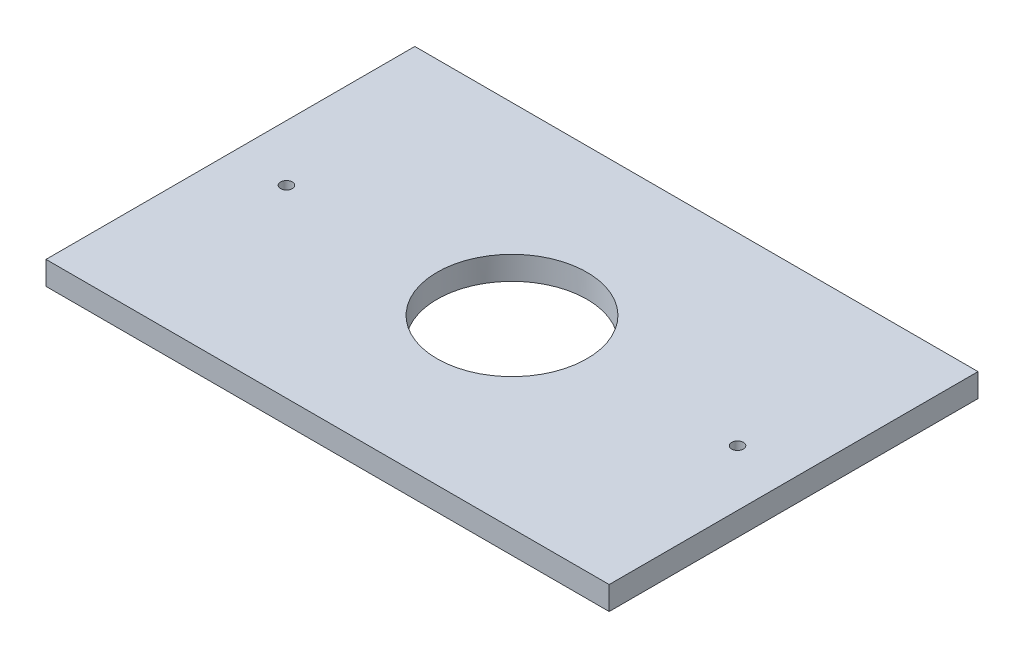
ISO-10303-21;
HEADER;
FILE_DESCRIPTION(('STEP AP214'),'2;1');
FILE_NAME('part.step','',(''),(''),'','','');
FILE_SCHEMA(('AUTOMOTIVE_DESIGN { 1 0 10303 214 1 1 1 1 }'));
ENDSEC;
DATA;
#1=APPLICATION_CONTEXT('core data for automotive mechanical design processes');
#2=APPLICATION_PROTOCOL_DEFINITION('international standard','automotive_design',2000,#1);
#3=PRODUCT_CONTEXT('',#1,'mechanical');
#4=PRODUCT('Part','Part','',(#3));
#5=PRODUCT_RELATED_PRODUCT_CATEGORY('part','',(#4));
#6=PRODUCT_DEFINITION_FORMATION('','',#4);
#7=PRODUCT_DEFINITION_CONTEXT('part definition',#1,'design');
#8=PRODUCT_DEFINITION('design','',#6,#7);
#9=PRODUCT_DEFINITION_SHAPE('','',#8);
#10=(LENGTH_UNIT() NAMED_UNIT(*) SI_UNIT(.MILLI.,.METRE.));
#11=(NAMED_UNIT(*) PLANE_ANGLE_UNIT() SI_UNIT($,.RADIAN.));
#12=(NAMED_UNIT(*) SI_UNIT($,.STERADIAN.) SOLID_ANGLE_UNIT());
#13=UNCERTAINTY_MEASURE_WITH_UNIT(LENGTH_MEASURE(1.E-05),#10,'distance_accuracy_value','');
#14=(GEOMETRIC_REPRESENTATION_CONTEXT(3) GLOBAL_UNCERTAINTY_ASSIGNED_CONTEXT((#13)) GLOBAL_UNIT_ASSIGNED_CONTEXT((#10,
#11,#12)) REPRESENTATION_CONTEXT('',''));
#15=CARTESIAN_POINT('',(0.,0.,0.));
#16=DIRECTION('',(0.,0.,1.));
#17=DIRECTION('',(1.,0.,0.));
#18=AXIS2_PLACEMENT_3D('',#15,#16,#17);
#19=CARTESIAN_POINT('',(0.,6.35,0.));
#20=DIRECTION('',(1.,0.,0.));
#21=DIRECTION('',(0.,0.,-1.));
#22=AXIS2_PLACEMENT_3D('',#19,#20,#21);
#23=PLANE('',#22);
#24=DIRECTION('',(0.,0.,1.));
#25=VECTOR('',#24,1.);
#26=CARTESIAN_POINT('',(0.,0.,0.));
#27=LINE('',#26,#25);
#28=CARTESIAN_POINT('',(0.,0.,-100.));
#29=VERTEX_POINT('',#28);
#30=CARTESIAN_POINT('',(0.,0.,0.));
#31=VERTEX_POINT('',#30);
#32=EDGE_CURVE('E99',#29,#31,#27,.T.);
#33=ORIENTED_EDGE('',*,*,#32,.T.);
#34=DIRECTION('',(0.,-1.,0.));
#35=VECTOR('',#34,1.);
#36=CARTESIAN_POINT('',(0.,6.35,0.));
#37=LINE('',#36,#35);
#38=CARTESIAN_POINT('',(0.,6.35,0.));
#39=VERTEX_POINT('',#38);
#40=EDGE_CURVE('E11',#39,#31,#37,.T.);
#41=ORIENTED_EDGE('',*,*,#40,.F.);
#42=DIRECTION('',(0.,0.,1.));
#43=VECTOR('',#42,1.);
#44=CARTESIAN_POINT('',(0.,6.35,0.));
#45=LINE('',#44,#43);
#46=CARTESIAN_POINT('',(0.,6.35,-100.));
#47=VERTEX_POINT('',#46);
#48=EDGE_CURVE('E86',#47,#39,#45,.T.);
#49=ORIENTED_EDGE('',*,*,#48,.F.);
#50=DIRECTION('',(0.,-1.,0.));
#51=VECTOR('',#50,1.);
#52=CARTESIAN_POINT('',(0.,6.35,-100.));
#53=LINE('',#52,#51);
#54=EDGE_CURVE('E95',#47,#29,#53,.T.);
#55=ORIENTED_EDGE('',*,*,#54,.T.);
#56=EDGE_LOOP('',(#33,#41,#49,#55));
#57=FACE_BOUND('',#56,.T.);
#58=ADVANCED_FACE('F33',(#57),#23,.F.);
#59=CARTESIAN_POINT('',(0.,6.35,0.));
#60=DIRECTION('',(0.,0.,-1.));
#61=DIRECTION('',(-1.,0.,0.));
#62=AXIS2_PLACEMENT_3D('',#59,#60,#61);
#63=PLANE('',#62);
#64=DIRECTION('',(1.,0.,0.));
#65=VECTOR('',#64,1.);
#66=CARTESIAN_POINT('',(0.,0.,0.));
#67=LINE('',#66,#65);
#68=CARTESIAN_POINT('',(152.7,0.,0.));
#69=VERTEX_POINT('',#68);
#70=EDGE_CURVE('E90',#31,#69,#67,.T.);
#71=ORIENTED_EDGE('',*,*,#70,.T.);
#72=DIRECTION('',(0.,-1.,0.));
#73=VECTOR('',#72,1.);
#74=CARTESIAN_POINT('',(152.7,6.35,0.));
#75=LINE('',#74,#73);
#76=CARTESIAN_POINT('',(152.7,6.35,0.));
#77=VERTEX_POINT('',#76);
#78=EDGE_CURVE('E42',#77,#69,#75,.T.);
#79=ORIENTED_EDGE('',*,*,#78,.F.);
#80=DIRECTION('',(1.,0.,0.));
#81=VECTOR('',#80,1.);
#82=CARTESIAN_POINT('',(0.,6.35,0.));
#83=LINE('',#82,#81);
#84=EDGE_CURVE('E81',#39,#77,#83,.T.);
#85=ORIENTED_EDGE('',*,*,#84,.F.);
#86=ORIENTED_EDGE('',*,*,#40,.T.);
#87=EDGE_LOOP('',(#71,#79,#85,#86));
#88=FACE_BOUND('',#87,.T.);
#89=ADVANCED_FACE('F89',(#88),#63,.F.);
#90=CARTESIAN_POINT('',(152.7,6.35,0.));
#91=DIRECTION('',(-1.,0.,0.));
#92=DIRECTION('',(0.,0.,1.));
#93=AXIS2_PLACEMENT_3D('',#90,#91,#92);
#94=PLANE('',#93);
#95=DIRECTION('',(0.,0.,-1.));
#96=VECTOR('',#95,1.);
#97=CARTESIAN_POINT('',(152.7,0.,0.));
#98=LINE('',#97,#96);
#99=CARTESIAN_POINT('',(152.7,0.,-100.));
#100=VERTEX_POINT('',#99);
#101=EDGE_CURVE('E68',#69,#100,#98,.T.);
#102=ORIENTED_EDGE('',*,*,#101,.T.);
#103=DIRECTION('',(0.,-1.,0.));
#104=VECTOR('',#103,1.);
#105=CARTESIAN_POINT('',(152.7,6.35,-100.));
#106=LINE('',#105,#104);
#107=CARTESIAN_POINT('',(152.7,6.35,-100.));
#108=VERTEX_POINT('',#107);
#109=EDGE_CURVE('E91',#108,#100,#106,.T.);
#110=ORIENTED_EDGE('',*,*,#109,.F.);
#111=DIRECTION('',(0.,0.,-1.));
#112=VECTOR('',#111,1.);
#113=CARTESIAN_POINT('',(152.7,6.35,0.));
#114=LINE('',#113,#112);
#115=EDGE_CURVE('E84',#77,#108,#114,.T.);
#116=ORIENTED_EDGE('',*,*,#115,.F.);
#117=ORIENTED_EDGE('',*,*,#78,.T.);
#118=EDGE_LOOP('',(#102,#110,#116,#117));
#119=FACE_BOUND('',#118,.T.);
#120=ADVANCED_FACE('F93',(#119),#94,.F.);
#121=CARTESIAN_POINT('',(0.,6.35,-100.));
#122=DIRECTION('',(0.,0.,1.));
#123=DIRECTION('',(1.,0.,0.));
#124=AXIS2_PLACEMENT_3D('',#121,#122,#123);
#125=PLANE('',#124);
#126=DIRECTION('',(-1.,0.,0.));
#127=VECTOR('',#126,1.);
#128=CARTESIAN_POINT('',(0.,0.,-100.));
#129=LINE('',#128,#127);
#130=EDGE_CURVE('E74',#100,#29,#129,.T.);
#131=ORIENTED_EDGE('',*,*,#130,.T.);
#132=ORIENTED_EDGE('',*,*,#54,.F.);
#133=DIRECTION('',(-1.,0.,0.));
#134=VECTOR('',#133,1.);
#135=CARTESIAN_POINT('',(0.,6.35,-100.));
#136=LINE('',#135,#134);
#137=EDGE_CURVE('E51',#108,#47,#136,.T.);
#138=ORIENTED_EDGE('',*,*,#137,.F.);
#139=ORIENTED_EDGE('',*,*,#109,.T.);
#140=EDGE_LOOP('',(#131,#132,#138,#139));
#141=FACE_BOUND('',#140,.T.);
#142=ADVANCED_FACE('F131',(#141),#125,.F.);
#143=CARTESIAN_POINT('',(0.,6.35,0.));
#144=DIRECTION('',(0.,-1.,0.));
#145=DIRECTION('',(0.,0.,-1.));
#146=AXIS2_PLACEMENT_3D('',#143,#144,#145);
#147=PLANE('',#146);
#148=CARTESIAN_POINT('',(15.2,6.35,-50.));
#149=DIRECTION('',(0.,1.,0.));
#150=DIRECTION('',(0.,0.,1.));
#151=AXIS2_PLACEMENT_3D('',#148,#149,#150);
#152=CIRCLE('',#151,1.5875);
#153=CARTESIAN_POINT('',(15.2,6.35,-48.4125));
#154=VERTEX_POINT('',#153);
#155=EDGE_CURVE('E112',#154,#154,#152,.T.);
#156=ORIENTED_EDGE('',*,*,#155,.F.);
#157=EDGE_LOOP('',(#156));
#158=FACE_BOUND('',#157,.T.);
#159=CARTESIAN_POINT('',(137.5,6.35,-50.));
#160=DIRECTION('',(0.,1.,0.));
#161=DIRECTION('',(0.,0.,1.));
#162=AXIS2_PLACEMENT_3D('',#159,#160,#161);
#163=CIRCLE('',#162,1.58749999999999);
#164=CARTESIAN_POINT('',(137.5,6.35,-48.4125));
#165=VERTEX_POINT('',#164);
#166=EDGE_CURVE('E117',#165,#165,#163,.T.);
#167=ORIENTED_EDGE('',*,*,#166,.F.);
#168=EDGE_LOOP('',(#167));
#169=FACE_BOUND('',#168,.T.);
#170=CARTESIAN_POINT('',(76.35,6.35,-50.));
#171=DIRECTION('',(0.,1.,0.));
#172=DIRECTION('',(0.,0.,1.));
#173=AXIS2_PLACEMENT_3D('',#170,#171,#172);
#174=CIRCLE('',#173,20.32);
#175=CARTESIAN_POINT('',(76.35,6.35,-29.68));
#176=VERTEX_POINT('',#175);
#177=EDGE_CURVE('E109',#176,#176,#174,.T.);
#178=ORIENTED_EDGE('',*,*,#177,.F.);
#179=EDGE_LOOP('',(#178));
#180=FACE_BOUND('',#179,.T.);
#181=ORIENTED_EDGE('',*,*,#48,.T.);
#182=ORIENTED_EDGE('',*,*,#84,.T.);
#183=ORIENTED_EDGE('',*,*,#115,.T.);
#184=ORIENTED_EDGE('',*,*,#137,.T.);
#185=EDGE_LOOP('',(#181,#182,#183,#184));
#186=FACE_BOUND('',#185,.T.);
#187=ADVANCED_FACE('F82',(#158,#169,#180,#186),#147,.F.);
#188=CARTESIAN_POINT('',(0.,0.,0.));
#189=DIRECTION('',(0.,-1.,0.));
#190=DIRECTION('',(0.,0.,-1.));
#191=AXIS2_PLACEMENT_3D('',#188,#189,#190);
#192=PLANE('',#191);
#193=CARTESIAN_POINT('',(15.2,0.,-50.));
#194=DIRECTION('',(0.,-1.,0.));
#195=DIRECTION('',(0.,0.,-1.));
#196=AXIS2_PLACEMENT_3D('',#193,#194,#195);
#197=CIRCLE('',#196,1.5875);
#198=CARTESIAN_POINT('',(15.2,0.,-51.5875));
#199=VERTEX_POINT('',#198);
#200=EDGE_CURVE('E36',#199,#199,#197,.T.);
#201=ORIENTED_EDGE('',*,*,#200,.F.);
#202=EDGE_LOOP('',(#201));
#203=FACE_BOUND('',#202,.T.);
#204=CARTESIAN_POINT('',(137.5,0.,-50.));
#205=DIRECTION('',(0.,-1.,0.));
#206=DIRECTION('',(0.,0.,-1.));
#207=AXIS2_PLACEMENT_3D('',#204,#205,#206);
#208=CIRCLE('',#207,1.58749999999999);
#209=CARTESIAN_POINT('',(137.5,0.,-51.5875));
#210=VERTEX_POINT('',#209);
#211=EDGE_CURVE('E110',#210,#210,#208,.T.);
#212=ORIENTED_EDGE('',*,*,#211,.F.);
#213=EDGE_LOOP('',(#212));
#214=FACE_BOUND('',#213,.T.);
#215=CARTESIAN_POINT('',(76.35,0.,-50.));
#216=DIRECTION('',(0.,-1.,0.));
#217=DIRECTION('',(0.,0.,-1.));
#218=AXIS2_PLACEMENT_3D('',#215,#216,#217);
#219=CIRCLE('',#218,20.32);
#220=CARTESIAN_POINT('',(76.35,0.,-70.32));
#221=VERTEX_POINT('',#220);
#222=EDGE_CURVE('E102',#221,#221,#219,.T.);
#223=ORIENTED_EDGE('',*,*,#222,.F.);
#224=EDGE_LOOP('',(#223));
#225=FACE_BOUND('',#224,.T.);
#226=ORIENTED_EDGE('',*,*,#32,.F.);
#227=ORIENTED_EDGE('',*,*,#130,.F.);
#228=ORIENTED_EDGE('',*,*,#101,.F.);
#229=ORIENTED_EDGE('',*,*,#70,.F.);
#230=EDGE_LOOP('',(#226,#227,#228,#229));
#231=FACE_BOUND('',#230,.T.);
#232=ADVANCED_FACE('F130',(#203,#214,#225,#231),#192,.T.);
#233=CARTESIAN_POINT('',(76.35,-3.65,-50.));
#234=DIRECTION('',(0.,1.,0.));
#235=DIRECTION('',(0.,0.,1.));
#236=AXIS2_PLACEMENT_3D('',#233,#234,#235);
#237=CYLINDRICAL_SURFACE('',#236,20.32);
#238=ORIENTED_EDGE('',*,*,#222,.T.);
#239=EDGE_LOOP('',(#238));
#240=FACE_BOUND('',#239,.T.);
#241=ORIENTED_EDGE('',*,*,#177,.T.);
#242=EDGE_LOOP('',(#241));
#243=FACE_BOUND('',#242,.T.);
#244=ADVANCED_FACE('F127',(#240,#243),#237,.F.);
#245=CARTESIAN_POINT('',(137.5,-3.65,-50.));
#246=DIRECTION('',(0.,1.,0.));
#247=DIRECTION('',(0.,0.,1.));
#248=AXIS2_PLACEMENT_3D('',#245,#246,#247);
#249=CYLINDRICAL_SURFACE('',#248,1.58749999999999);
#250=ORIENTED_EDGE('',*,*,#211,.T.);
#251=EDGE_LOOP('',(#250));
#252=FACE_BOUND('',#251,.T.);
#253=ORIENTED_EDGE('',*,*,#166,.T.);
#254=EDGE_LOOP('',(#253));
#255=FACE_BOUND('',#254,.T.);
#256=ADVANCED_FACE('F169',(#252,#255),#249,.F.);
#257=CARTESIAN_POINT('',(15.2,-3.65,-50.));
#258=DIRECTION('',(0.,1.,0.));
#259=DIRECTION('',(0.,0.,1.));
#260=AXIS2_PLACEMENT_3D('',#257,#258,#259);
#261=CYLINDRICAL_SURFACE('',#260,1.5875);
#262=ORIENTED_EDGE('',*,*,#200,.T.);
#263=EDGE_LOOP('',(#262));
#264=FACE_BOUND('',#263,.T.);
#265=ORIENTED_EDGE('',*,*,#155,.T.);
#266=EDGE_LOOP('',(#265));
#267=FACE_BOUND('',#266,.T.);
#268=ADVANCED_FACE('F188',(#264,#267),#261,.F.);
#269=CLOSED_SHELL('',(#58,#89,#120,#142,#187,#232,#244,#256,#268));
#270=MANIFOLD_SOLID_BREP('B2',#269);
#271=ADVANCED_BREP_SHAPE_REPRESENTATION('',(#18,#270),#14);
#272=SHAPE_DEFINITION_REPRESENTATION(#9,#271);
ENDSEC;
END-ISO-10303-21;
